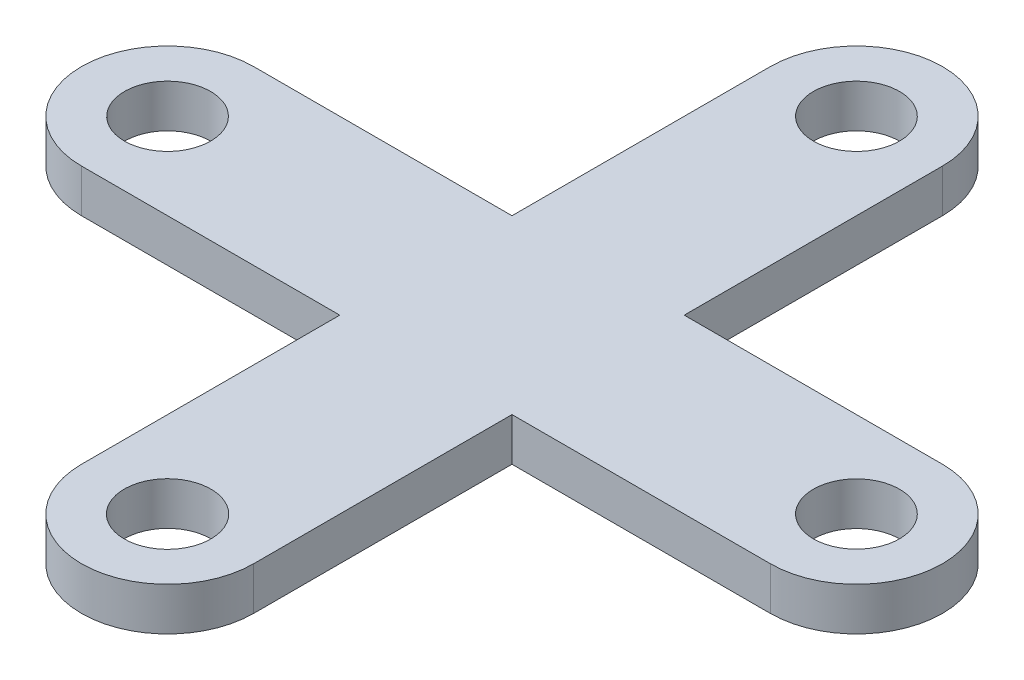
ISO-10303-21;
HEADER;
FILE_DESCRIPTION(('STEP AP214'),'2;1');
FILE_NAME('part.step','',(''),(''),'','','');
FILE_SCHEMA(('AUTOMOTIVE_DESIGN { 1 0 10303 214 1 1 1 1 }'));
ENDSEC;
DATA;
#1=APPLICATION_CONTEXT('core data for automotive mechanical design processes');
#2=APPLICATION_PROTOCOL_DEFINITION('international standard','automotive_design',2000,#1);
#3=PRODUCT_CONTEXT('',#1,'mechanical');
#4=PRODUCT('Part','Part','',(#3));
#5=PRODUCT_RELATED_PRODUCT_CATEGORY('part','',(#4));
#6=PRODUCT_DEFINITION_FORMATION('','',#4);
#7=PRODUCT_DEFINITION_CONTEXT('part definition',#1,'design');
#8=PRODUCT_DEFINITION('design','',#6,#7);
#9=PRODUCT_DEFINITION_SHAPE('','',#8);
#10=(LENGTH_UNIT() NAMED_UNIT(*) SI_UNIT(.MILLI.,.METRE.));
#11=(NAMED_UNIT(*) PLANE_ANGLE_UNIT() SI_UNIT($,.RADIAN.));
#12=(NAMED_UNIT(*) SI_UNIT($,.STERADIAN.) SOLID_ANGLE_UNIT());
#13=UNCERTAINTY_MEASURE_WITH_UNIT(LENGTH_MEASURE(1.E-05),#10,'distance_accuracy_value','');
#14=(GEOMETRIC_REPRESENTATION_CONTEXT(3) GLOBAL_UNCERTAINTY_ASSIGNED_CONTEXT((#13)) GLOBAL_UNIT_ASSIGNED_CONTEXT((#10,
#11,#12)) REPRESENTATION_CONTEXT('',''));
#15=CARTESIAN_POINT('',(0.,0.,0.));
#16=DIRECTION('',(0.,0.,1.));
#17=DIRECTION('',(1.,0.,0.));
#18=AXIS2_PLACEMENT_3D('',#15,#16,#17);
#19=CARTESIAN_POINT('',(0.,0.,0.));
#20=DIRECTION('',(0.,1.,0.));
#21=DIRECTION('',(0.,0.,1.));
#22=AXIS2_PLACEMENT_3D('',#19,#20,#21);
#23=PLANE('',#22);
#24=DIRECTION('',(0.,0.,1.));
#25=VECTOR('',#24,1.);
#26=CARTESIAN_POINT('',(12.7,0.,0.));
#27=LINE('',#26,#25);
#28=CARTESIAN_POINT('',(12.7,0.,-74.1615560527678));
#29=VERTEX_POINT('',#28);
#30=CARTESIAN_POINT('',(12.7,0.,-36.0615560527679));
#31=VERTEX_POINT('',#30);
#32=EDGE_CURVE('E165',#29,#31,#27,.T.);
#33=ORIENTED_EDGE('',*,*,#32,.T.);
#34=DIRECTION('',(1.,0.,0.));
#35=VECTOR('',#34,1.);
#36=CARTESIAN_POINT('',(0.,0.,-36.0615560527679));
#37=LINE('',#36,#35);
#38=CARTESIAN_POINT('',(50.8,0.,-36.0615560527679));
#39=VERTEX_POINT('',#38);
#40=EDGE_CURVE('E191',#31,#39,#37,.T.);
#41=ORIENTED_EDGE('',*,*,#40,.T.);
#42=CARTESIAN_POINT('',(50.8,0.,-23.3615560527679));
#43=DIRECTION('',(0.,1.,0.));
#44=DIRECTION('',(0.,0.,1.));
#45=AXIS2_PLACEMENT_3D('',#42,#43,#44);
#46=CIRCLE('',#45,12.7);
#47=CARTESIAN_POINT('',(50.8,0.,-10.6615560527679));
#48=VERTEX_POINT('',#47);
#49=EDGE_CURVE('E189',#48,#39,#46,.T.);
#50=ORIENTED_EDGE('',*,*,#49,.F.);
#51=DIRECTION('',(1.,0.,0.));
#52=VECTOR('',#51,1.);
#53=CARTESIAN_POINT('',(0.,0.,-10.6615560527679));
#54=LINE('',#53,#52);
#55=CARTESIAN_POINT('',(12.7,0.,-10.6615560527679));
#56=VERTEX_POINT('',#55);
#57=EDGE_CURVE('E152',#56,#48,#54,.T.);
#58=ORIENTED_EDGE('',*,*,#57,.F.);
#59=DIRECTION('',(0.,0.,1.));
#60=VECTOR('',#59,1.);
#61=CARTESIAN_POINT('',(12.7,0.,0.));
#62=LINE('',#61,#60);
#63=CARTESIAN_POINT('',(12.7,0.,27.4384439472321));
#64=VERTEX_POINT('',#63);
#65=EDGE_CURVE('E185',#56,#64,#62,.T.);
#66=ORIENTED_EDGE('',*,*,#65,.T.);
#67=CARTESIAN_POINT('',(0.,0.,27.4384439472321));
#68=DIRECTION('',(0.,1.,0.));
#69=DIRECTION('',(0.,0.,1.));
#70=AXIS2_PLACEMENT_3D('',#67,#68,#69);
#71=CIRCLE('',#70,12.7);
#72=CARTESIAN_POINT('',(-12.7,0.,27.4384439472321));
#73=VERTEX_POINT('',#72);
#74=EDGE_CURVE('E182',#73,#64,#71,.T.);
#75=ORIENTED_EDGE('',*,*,#74,.F.);
#76=DIRECTION('',(0.,0.,1.));
#77=VECTOR('',#76,1.);
#78=CARTESIAN_POINT('',(-12.7,0.,0.));
#79=LINE('',#78,#77);
#80=CARTESIAN_POINT('',(-12.7,0.,-10.6615560527679));
#81=VERTEX_POINT('',#80);
#82=EDGE_CURVE('E180',#81,#73,#79,.T.);
#83=ORIENTED_EDGE('',*,*,#82,.F.);
#84=DIRECTION('',(1.,0.,0.));
#85=VECTOR('',#84,1.);
#86=CARTESIAN_POINT('',(0.,0.,-10.6615560527679));
#87=LINE('',#86,#85);
#88=CARTESIAN_POINT('',(-50.8,0.,-10.6615560527679));
#89=VERTEX_POINT('',#88);
#90=EDGE_CURVE('E178',#89,#81,#87,.T.);
#91=ORIENTED_EDGE('',*,*,#90,.F.);
#92=CARTESIAN_POINT('',(-50.8,0.,-23.3615560527679));
#93=DIRECTION('',(0.,1.,0.));
#94=DIRECTION('',(0.,0.,1.));
#95=AXIS2_PLACEMENT_3D('',#92,#93,#94);
#96=CIRCLE('',#95,12.7);
#97=CARTESIAN_POINT('',(-50.8,0.,-36.0615560527679));
#98=VERTEX_POINT('',#97);
#99=EDGE_CURVE('E176',#98,#89,#96,.T.);
#100=ORIENTED_EDGE('',*,*,#99,.F.);
#101=DIRECTION('',(1.,0.,0.));
#102=VECTOR('',#101,1.);
#103=CARTESIAN_POINT('',(0.,0.,-36.0615560527679));
#104=LINE('',#103,#102);
#105=CARTESIAN_POINT('',(-12.7,0.,-36.0615560527679));
#106=VERTEX_POINT('',#105);
#107=EDGE_CURVE('E173',#98,#106,#104,.T.);
#108=ORIENTED_EDGE('',*,*,#107,.T.);
#109=DIRECTION('',(0.,0.,1.));
#110=VECTOR('',#109,1.);
#111=CARTESIAN_POINT('',(-12.7,0.,0.));
#112=LINE('',#111,#110);
#113=CARTESIAN_POINT('',(-12.7,0.,-74.1615560527678));
#114=VERTEX_POINT('',#113);
#115=EDGE_CURVE('E170',#114,#106,#112,.T.);
#116=ORIENTED_EDGE('',*,*,#115,.F.);
#117=CARTESIAN_POINT('',(0.,0.,-74.1615560527678));
#118=DIRECTION('',(0.,1.,0.));
#119=DIRECTION('',(0.,0.,1.));
#120=AXIS2_PLACEMENT_3D('',#117,#118,#119);
#121=CIRCLE('',#120,12.7);
#122=EDGE_CURVE('E167',#29,#114,#121,.T.);
#123=ORIENTED_EDGE('',*,*,#122,.F.);
#124=EDGE_LOOP('',(#33,#41,#50,#58,#66,#75,#83,#91,#100,#108,#116,#123));
#125=FACE_BOUND('',#124,.T.);
#126=CARTESIAN_POINT('',(0.,0.,-74.1615560527678));
#127=DIRECTION('',(0.,1.,0.));
#128=DIRECTION('',(0.,0.,1.));
#129=AXIS2_PLACEMENT_3D('',#126,#127,#128);
#130=CIRCLE('',#129,6.35);
#131=CARTESIAN_POINT('',(0.,0.,-67.8115560527679));
#132=VERTEX_POINT('',#131);
#133=EDGE_CURVE('E168',#132,#132,#130,.T.);
#134=ORIENTED_EDGE('',*,*,#133,.T.);
#135=EDGE_LOOP('',(#134));
#136=FACE_BOUND('',#135,.T.);
#137=CARTESIAN_POINT('',(-50.8,0.,-23.3615560527679));
#138=DIRECTION('',(0.,1.,0.));
#139=DIRECTION('',(0.,0.,1.));
#140=AXIS2_PLACEMENT_3D('',#137,#138,#139);
#141=CIRCLE('',#140,6.35);
#142=CARTESIAN_POINT('',(-50.8,0.,-17.0115560527679));
#143=VERTEX_POINT('',#142);
#144=EDGE_CURVE('E256',#143,#143,#141,.T.);
#145=ORIENTED_EDGE('',*,*,#144,.T.);
#146=EDGE_LOOP('',(#145));
#147=FACE_BOUND('',#146,.T.);
#148=CARTESIAN_POINT('',(0.,0.,27.4384439472321));
#149=DIRECTION('',(0.,1.,0.));
#150=DIRECTION('',(0.,0.,1.));
#151=AXIS2_PLACEMENT_3D('',#148,#149,#150);
#152=CIRCLE('',#151,6.38209935399388);
#153=CARTESIAN_POINT('',(0.,0.,33.820543301226));
#154=VERTEX_POINT('',#153);
#155=EDGE_CURVE('E262',#154,#154,#152,.T.);
#156=ORIENTED_EDGE('',*,*,#155,.T.);
#157=EDGE_LOOP('',(#156));
#158=FACE_BOUND('',#157,.T.);
#159=CARTESIAN_POINT('',(50.8,0.,-23.3615560527679));
#160=DIRECTION('',(0.,1.,0.));
#161=DIRECTION('',(0.,0.,1.));
#162=AXIS2_PLACEMENT_3D('',#159,#160,#161);
#163=CIRCLE('',#162,6.35);
#164=CARTESIAN_POINT('',(50.8,0.,-17.0115560527679));
#165=VERTEX_POINT('',#164);
#166=EDGE_CURVE('E268',#165,#165,#163,.T.);
#167=ORIENTED_EDGE('',*,*,#166,.T.);
#168=EDGE_LOOP('',(#167));
#169=FACE_BOUND('',#168,.T.);
#170=DIRECTION('',(1.,0.,0.));
#171=VECTOR('',#170,1.);
#172=CARTESIAN_POINT('',(0.,0.,-11.9616007035296));
#173=LINE('',#172,#171);
#174=CARTESIAN_POINT('',(-12.7,0.,-11.9616007035296));
#175=VERTEX_POINT('',#174);
#176=CARTESIAN_POINT('',(12.26032933786,0.,-11.9616007035296));
#177=VERTEX_POINT('',#176);
#178=EDGE_CURVE('E49',#175,#177,#173,.T.);
#179=ORIENTED_EDGE('',*,*,#178,.T.);
#180=DIRECTION('',(0.,0.,-1.));
#181=VECTOR('',#180,1.);
#182=CARTESIAN_POINT('',(12.26032933786,0.,0.));
#183=LINE('',#182,#181);
#184=CARTESIAN_POINT('',(12.26032933786,0.,-35.1916983963169));
#185=VERTEX_POINT('',#184);
#186=EDGE_CURVE('E294',#177,#185,#183,.T.);
#187=ORIENTED_EDGE('',*,*,#186,.T.);
#188=DIRECTION('',(1.,0.,0.));
#189=VECTOR('',#188,1.);
#190=CARTESIAN_POINT('',(0.,0.,-35.1916983963169));
#191=LINE('',#190,#189);
#192=CARTESIAN_POINT('',(-12.7,0.,-35.1916983963169));
#193=VERTEX_POINT('',#192);
#194=EDGE_CURVE('E291',#193,#185,#191,.T.);
#195=ORIENTED_EDGE('',*,*,#194,.F.);
#196=DIRECTION('',(0.,0.,-1.));
#197=VECTOR('',#196,1.);
#198=CARTESIAN_POINT('',(-12.7,0.,0.));
#199=LINE('',#198,#197);
#200=EDGE_CURVE('E287',#175,#193,#199,.T.);
#201=ORIENTED_EDGE('',*,*,#200,.F.);
#202=EDGE_LOOP('',(#179,#187,#195,#201));
#203=FACE_BOUND('',#202,.T.);
#204=ADVANCED_FACE('F34',(#125,#136,#147,#158,#169,#203),#23,.F.);
#205=CARTESIAN_POINT('',(12.7,6.35,0.));
#206=DIRECTION('',(1.,0.,0.));
#207=DIRECTION('',(0.,0.,-1.));
#208=AXIS2_PLACEMENT_3D('',#205,#206,#207);
#209=PLANE('',#208);
#210=ORIENTED_EDGE('',*,*,#32,.F.);
#211=DIRECTION('',(0.,-1.,0.));
#212=VECTOR('',#211,1.);
#213=CARTESIAN_POINT('',(12.7,6.35,-74.1615560527678));
#214=LINE('',#213,#212);
#215=CARTESIAN_POINT('',(12.7,6.35,-74.1615560527678));
#216=VERTEX_POINT('',#215);
#217=EDGE_CURVE('E11',#216,#29,#214,.T.);
#218=ORIENTED_EDGE('',*,*,#217,.F.);
#219=DIRECTION('',(0.,0.,1.));
#220=VECTOR('',#219,1.);
#221=CARTESIAN_POINT('',(12.7,6.35,0.));
#222=LINE('',#221,#220);
#223=CARTESIAN_POINT('',(12.7,6.35,-36.0615560527679));
#224=VERTEX_POINT('',#223);
#225=EDGE_CURVE('E194',#216,#224,#222,.T.);
#226=ORIENTED_EDGE('',*,*,#225,.T.);
#227=DIRECTION('',(0.,-1.,0.));
#228=VECTOR('',#227,1.);
#229=CARTESIAN_POINT('',(12.7,6.35,-36.0615560527679));
#230=LINE('',#229,#228);
#231=EDGE_CURVE('E58',#224,#31,#230,.T.);
#232=ORIENTED_EDGE('',*,*,#231,.T.);
#233=EDGE_LOOP('',(#210,#218,#226,#232));
#234=FACE_BOUND('',#233,.T.);
#235=ADVANCED_FACE('F36',(#234),#209,.T.);
#236=CARTESIAN_POINT('',(0.,6.35,-74.1615560527678));
#237=DIRECTION('',(0.,-1.,0.));
#238=DIRECTION('',(0.,0.,-1.));
#239=AXIS2_PLACEMENT_3D('',#236,#237,#238);
#240=CYLINDRICAL_SURFACE('',#239,12.7);
#241=ORIENTED_EDGE('',*,*,#122,.T.);
#242=DIRECTION('',(0.,-1.,0.));
#243=VECTOR('',#242,1.);
#244=CARTESIAN_POINT('',(-12.7,6.35,-74.1615560527678));
#245=LINE('',#244,#243);
#246=CARTESIAN_POINT('',(-12.7,6.35,-74.1615560527678));
#247=VERTEX_POINT('',#246);
#248=EDGE_CURVE('E42',#247,#114,#245,.T.);
#249=ORIENTED_EDGE('',*,*,#248,.F.);
#250=CARTESIAN_POINT('',(0.,6.35,-74.1615560527678));
#251=DIRECTION('',(0.,1.,0.));
#252=DIRECTION('',(0.,0.,1.));
#253=AXIS2_PLACEMENT_3D('',#250,#251,#252);
#254=CIRCLE('',#253,12.7);
#255=EDGE_CURVE('E237',#216,#247,#254,.T.);
#256=ORIENTED_EDGE('',*,*,#255,.F.);
#257=ORIENTED_EDGE('',*,*,#217,.T.);
#258=EDGE_LOOP('',(#241,#249,#256,#257));
#259=FACE_BOUND('',#258,.T.);
#260=ADVANCED_FACE('F348',(#259),#240,.T.);
#261=CARTESIAN_POINT('',(-12.7,6.35,0.));
#262=DIRECTION('',(1.,0.,0.));
#263=DIRECTION('',(0.,0.,-1.));
#264=AXIS2_PLACEMENT_3D('',#261,#262,#263);
#265=PLANE('',#264);
#266=ORIENTED_EDGE('',*,*,#115,.T.);
#267=DIRECTION('',(0.,-1.,0.));
#268=VECTOR('',#267,1.);
#269=CARTESIAN_POINT('',(-12.7,6.35,-36.0615560527679));
#270=LINE('',#269,#268);
#271=CARTESIAN_POINT('',(-12.7,6.35,-36.0615560527679));
#272=VERTEX_POINT('',#271);
#273=EDGE_CURVE('E211',#272,#106,#270,.T.);
#274=ORIENTED_EDGE('',*,*,#273,.F.);
#275=DIRECTION('',(0.,0.,1.));
#276=VECTOR('',#275,1.);
#277=CARTESIAN_POINT('',(-12.7,6.35,0.));
#278=LINE('',#277,#276);
#279=EDGE_CURVE('E219',#247,#272,#278,.T.);
#280=ORIENTED_EDGE('',*,*,#279,.F.);
#281=ORIENTED_EDGE('',*,*,#248,.T.);
#282=EDGE_LOOP('',(#266,#274,#280,#281));
#283=FACE_BOUND('',#282,.T.);
#284=ADVANCED_FACE('F217',(#283),#265,.F.);
#285=CARTESIAN_POINT('',(0.,6.35,-36.0615560527679));
#286=DIRECTION('',(0.,0.,-1.));
#287=DIRECTION('',(-1.,0.,0.));
#288=AXIS2_PLACEMENT_3D('',#285,#286,#287);
#289=PLANE('',#288);
#290=ORIENTED_EDGE('',*,*,#107,.F.);
#291=DIRECTION('',(0.,-1.,0.));
#292=VECTOR('',#291,1.);
#293=CARTESIAN_POINT('',(-50.8,6.35,-36.0615560527679));
#294=LINE('',#293,#292);
#295=CARTESIAN_POINT('',(-50.8,6.35,-36.0615560527679));
#296=VERTEX_POINT('',#295);
#297=EDGE_CURVE('E209',#296,#98,#294,.T.);
#298=ORIENTED_EDGE('',*,*,#297,.F.);
#299=DIRECTION('',(1.,0.,0.));
#300=VECTOR('',#299,1.);
#301=CARTESIAN_POINT('',(0.,6.35,-36.0615560527679));
#302=LINE('',#301,#300);
#303=EDGE_CURVE('E232',#296,#272,#302,.T.);
#304=ORIENTED_EDGE('',*,*,#303,.T.);
#305=ORIENTED_EDGE('',*,*,#273,.T.);
#306=EDGE_LOOP('',(#290,#298,#304,#305));
#307=FACE_BOUND('',#306,.T.);
#308=ADVANCED_FACE('F228',(#307),#289,.T.);
#309=CARTESIAN_POINT('',(-50.8,6.35,-23.3615560527679));
#310=DIRECTION('',(0.,-1.,0.));
#311=DIRECTION('',(0.,0.,-1.));
#312=AXIS2_PLACEMENT_3D('',#309,#310,#311);
#313=CYLINDRICAL_SURFACE('',#312,12.7);
#314=ORIENTED_EDGE('',*,*,#99,.T.);
#315=DIRECTION('',(0.,-1.,0.));
#316=VECTOR('',#315,1.);
#317=CARTESIAN_POINT('',(-50.8,6.35,-10.6615560527679));
#318=LINE('',#317,#316);
#319=CARTESIAN_POINT('',(-50.8,6.35,-10.6615560527679));
#320=VERTEX_POINT('',#319);
#321=EDGE_CURVE('E206',#320,#89,#318,.T.);
#322=ORIENTED_EDGE('',*,*,#321,.F.);
#323=CARTESIAN_POINT('',(-50.8,6.35,-23.3615560527679));
#324=DIRECTION('',(0.,1.,0.));
#325=DIRECTION('',(0.,0.,1.));
#326=AXIS2_PLACEMENT_3D('',#323,#324,#325);
#327=CIRCLE('',#326,12.7);
#328=EDGE_CURVE('E233',#296,#320,#327,.T.);
#329=ORIENTED_EDGE('',*,*,#328,.F.);
#330=ORIENTED_EDGE('',*,*,#297,.T.);
#331=EDGE_LOOP('',(#314,#322,#329,#330));
#332=FACE_BOUND('',#331,.T.);
#333=ADVANCED_FACE('F371',(#332),#313,.T.);
#334=CARTESIAN_POINT('',(0.,6.35,-10.6615560527679));
#335=DIRECTION('',(0.,0.,-1.));
#336=DIRECTION('',(-1.,0.,0.));
#337=AXIS2_PLACEMENT_3D('',#334,#335,#336);
#338=PLANE('',#337);
#339=ORIENTED_EDGE('',*,*,#90,.T.);
#340=DIRECTION('',(0.,-1.,0.));
#341=VECTOR('',#340,1.);
#342=CARTESIAN_POINT('',(-12.7,6.35,-10.6615560527679));
#343=LINE('',#342,#341);
#344=CARTESIAN_POINT('',(-12.7,6.35,-10.6615560527679));
#345=VERTEX_POINT('',#344);
#346=EDGE_CURVE('E203',#345,#81,#343,.T.);
#347=ORIENTED_EDGE('',*,*,#346,.F.);
#348=DIRECTION('',(1.,0.,0.));
#349=VECTOR('',#348,1.);
#350=CARTESIAN_POINT('',(0.,6.35,-10.6615560527679));
#351=LINE('',#350,#349);
#352=EDGE_CURVE('E235',#320,#345,#351,.T.);
#353=ORIENTED_EDGE('',*,*,#352,.F.);
#354=ORIENTED_EDGE('',*,*,#321,.T.);
#355=EDGE_LOOP('',(#339,#347,#353,#354));
#356=FACE_BOUND('',#355,.T.);
#357=ADVANCED_FACE('F367',(#356),#338,.F.);
#358=CARTESIAN_POINT('',(-12.7,6.35,0.));
#359=DIRECTION('',(1.,0.,0.));
#360=DIRECTION('',(0.,0.,-1.));
#361=AXIS2_PLACEMENT_3D('',#358,#359,#360);
#362=PLANE('',#361);
#363=ORIENTED_EDGE('',*,*,#82,.T.);
#364=DIRECTION('',(0.,-1.,0.));
#365=VECTOR('',#364,1.);
#366=CARTESIAN_POINT('',(-12.7,6.35,27.4384439472321));
#367=LINE('',#366,#365);
#368=CARTESIAN_POINT('',(-12.7,6.35,27.4384439472321));
#369=VERTEX_POINT('',#368);
#370=EDGE_CURVE('E200',#369,#73,#367,.T.);
#371=ORIENTED_EDGE('',*,*,#370,.F.);
#372=DIRECTION('',(0.,0.,1.));
#373=VECTOR('',#372,1.);
#374=CARTESIAN_POINT('',(-12.7,6.35,0.));
#375=LINE('',#374,#373);
#376=EDGE_CURVE('E242',#345,#369,#375,.T.);
#377=ORIENTED_EDGE('',*,*,#376,.F.);
#378=ORIENTED_EDGE('',*,*,#346,.T.);
#379=EDGE_LOOP('',(#363,#371,#377,#378));
#380=FACE_BOUND('',#379,.T.);
#381=ADVANCED_FACE('F363',(#380),#362,.F.);
#382=CARTESIAN_POINT('',(0.,6.35,27.4384439472321));
#383=DIRECTION('',(0.,-1.,0.));
#384=DIRECTION('',(0.,0.,-1.));
#385=AXIS2_PLACEMENT_3D('',#382,#383,#384);
#386=CYLINDRICAL_SURFACE('',#385,12.7);
#387=ORIENTED_EDGE('',*,*,#74,.T.);
#388=DIRECTION('',(0.,-1.,0.));
#389=VECTOR('',#388,1.);
#390=CARTESIAN_POINT('',(12.7,6.35,27.4384439472321));
#391=LINE('',#390,#389);
#392=CARTESIAN_POINT('',(12.7,6.35,27.4384439472321));
#393=VERTEX_POINT('',#392);
#394=EDGE_CURVE('E198',#393,#64,#391,.T.);
#395=ORIENTED_EDGE('',*,*,#394,.F.);
#396=CARTESIAN_POINT('',(0.,6.35,27.4384439472321));
#397=DIRECTION('',(0.,1.,0.));
#398=DIRECTION('',(0.,0.,1.));
#399=AXIS2_PLACEMENT_3D('',#396,#397,#398);
#400=CIRCLE('',#399,12.7);
#401=EDGE_CURVE('E244',#369,#393,#400,.T.);
#402=ORIENTED_EDGE('',*,*,#401,.F.);
#403=ORIENTED_EDGE('',*,*,#370,.T.);
#404=EDGE_LOOP('',(#387,#395,#402,#403));
#405=FACE_BOUND('',#404,.T.);
#406=ADVANCED_FACE('F360',(#405),#386,.T.);
#407=CARTESIAN_POINT('',(12.7,6.35,0.));
#408=DIRECTION('',(1.,0.,0.));
#409=DIRECTION('',(0.,0.,-1.));
#410=AXIS2_PLACEMENT_3D('',#407,#408,#409);
#411=PLANE('',#410);
#412=ORIENTED_EDGE('',*,*,#65,.F.);
#413=DIRECTION('',(0.,-1.,0.));
#414=VECTOR('',#413,1.);
#415=CARTESIAN_POINT('',(12.7,6.35,-10.6615560527679));
#416=LINE('',#415,#414);
#417=CARTESIAN_POINT('',(12.7,6.35,-10.6615560527679));
#418=VERTEX_POINT('',#417);
#419=EDGE_CURVE('E156',#418,#56,#416,.T.);
#420=ORIENTED_EDGE('',*,*,#419,.F.);
#421=DIRECTION('',(0.,0.,1.));
#422=VECTOR('',#421,1.);
#423=CARTESIAN_POINT('',(12.7,6.35,0.));
#424=LINE('',#423,#422);
#425=EDGE_CURVE('E145',#418,#393,#424,.T.);
#426=ORIENTED_EDGE('',*,*,#425,.T.);
#427=ORIENTED_EDGE('',*,*,#394,.T.);
#428=EDGE_LOOP('',(#412,#420,#426,#427));
#429=FACE_BOUND('',#428,.T.);
#430=ADVANCED_FACE('F247',(#429),#411,.T.);
#431=CARTESIAN_POINT('',(0.,6.35,-10.6615560527679));
#432=DIRECTION('',(0.,0.,-1.));
#433=DIRECTION('',(-1.,0.,0.));
#434=AXIS2_PLACEMENT_3D('',#431,#432,#433);
#435=PLANE('',#434);
#436=ORIENTED_EDGE('',*,*,#57,.T.);
#437=DIRECTION('',(0.,-1.,0.));
#438=VECTOR('',#437,1.);
#439=CARTESIAN_POINT('',(50.8,6.35,-10.6615560527679));
#440=LINE('',#439,#438);
#441=CARTESIAN_POINT('',(50.8,6.35,-10.6615560527679));
#442=VERTEX_POINT('',#441);
#443=EDGE_CURVE('E149',#442,#48,#440,.T.);
#444=ORIENTED_EDGE('',*,*,#443,.F.);
#445=DIRECTION('',(1.,0.,0.));
#446=VECTOR('',#445,1.);
#447=CARTESIAN_POINT('',(0.,6.35,-10.6615560527679));
#448=LINE('',#447,#446);
#449=EDGE_CURVE('E136',#418,#442,#448,.T.);
#450=ORIENTED_EDGE('',*,*,#449,.F.);
#451=ORIENTED_EDGE('',*,*,#419,.T.);
#452=EDGE_LOOP('',(#436,#444,#450,#451));
#453=FACE_BOUND('',#452,.T.);
#454=ADVANCED_FACE('F150',(#453),#435,.F.);
#455=CARTESIAN_POINT('',(50.8,6.35,-23.3615560527679));
#456=DIRECTION('',(0.,-1.,0.));
#457=DIRECTION('',(0.,0.,-1.));
#458=AXIS2_PLACEMENT_3D('',#455,#456,#457);
#459=CYLINDRICAL_SURFACE('',#458,12.7);
#460=ORIENTED_EDGE('',*,*,#49,.T.);
#461=DIRECTION('',(0.,-1.,0.));
#462=VECTOR('',#461,1.);
#463=CARTESIAN_POINT('',(50.8,6.35,-36.0615560527679));
#464=LINE('',#463,#462);
#465=CARTESIAN_POINT('',(50.8,6.35,-36.0615560527679));
#466=VERTEX_POINT('',#465);
#467=EDGE_CURVE('E157',#466,#39,#464,.T.);
#468=ORIENTED_EDGE('',*,*,#467,.F.);
#469=CARTESIAN_POINT('',(50.8,6.35,-23.3615560527679));
#470=DIRECTION('',(0.,1.,0.));
#471=DIRECTION('',(0.,0.,1.));
#472=AXIS2_PLACEMENT_3D('',#469,#470,#471);
#473=CIRCLE('',#472,12.7);
#474=EDGE_CURVE('E142',#442,#466,#473,.T.);
#475=ORIENTED_EDGE('',*,*,#474,.F.);
#476=ORIENTED_EDGE('',*,*,#443,.T.);
#477=EDGE_LOOP('',(#460,#468,#475,#476));
#478=FACE_BOUND('',#477,.T.);
#479=ADVANCED_FACE('F159',(#478),#459,.T.);
#480=CARTESIAN_POINT('',(0.,6.35,-36.0615560527679));
#481=DIRECTION('',(0.,0.,-1.));
#482=DIRECTION('',(-1.,0.,0.));
#483=AXIS2_PLACEMENT_3D('',#480,#481,#482);
#484=PLANE('',#483);
#485=ORIENTED_EDGE('',*,*,#40,.F.);
#486=ORIENTED_EDGE('',*,*,#231,.F.);
#487=DIRECTION('',(1.,0.,0.));
#488=VECTOR('',#487,1.);
#489=CARTESIAN_POINT('',(0.,6.35,-36.0615560527679));
#490=LINE('',#489,#488);
#491=EDGE_CURVE('E160',#224,#466,#490,.T.);
#492=ORIENTED_EDGE('',*,*,#491,.T.);
#493=ORIENTED_EDGE('',*,*,#467,.T.);
#494=EDGE_LOOP('',(#485,#486,#492,#493));
#495=FACE_BOUND('',#494,.T.);
#496=ADVANCED_FACE('F250',(#495),#484,.T.);
#497=CARTESIAN_POINT('',(0.,6.35,0.));
#498=DIRECTION('',(0.,1.,0.));
#499=DIRECTION('',(0.,0.,1.));
#500=AXIS2_PLACEMENT_3D('',#497,#498,#499);
#501=PLANE('',#500);
#502=CARTESIAN_POINT('',(50.8,6.35,-23.3615560527679));
#503=DIRECTION('',(0.,1.,0.));
#504=DIRECTION('',(0.,0.,1.));
#505=AXIS2_PLACEMENT_3D('',#502,#503,#504);
#506=CIRCLE('',#505,6.35);
#507=CARTESIAN_POINT('',(50.8,6.35,-17.0115560527679));
#508=VERTEX_POINT('',#507);
#509=EDGE_CURVE('E271',#508,#508,#506,.T.);
#510=ORIENTED_EDGE('',*,*,#509,.F.);
#511=EDGE_LOOP('',(#510));
#512=FACE_BOUND('',#511,.T.);
#513=CARTESIAN_POINT('',(0.,6.35,27.4384439472321));
#514=DIRECTION('',(0.,1.,0.));
#515=DIRECTION('',(0.,0.,1.));
#516=AXIS2_PLACEMENT_3D('',#513,#514,#515);
#517=CIRCLE('',#516,6.38209935399388);
#518=CARTESIAN_POINT('',(0.,6.35,33.820543301226));
#519=VERTEX_POINT('',#518);
#520=EDGE_CURVE('E265',#519,#519,#517,.T.);
#521=ORIENTED_EDGE('',*,*,#520,.F.);
#522=EDGE_LOOP('',(#521));
#523=FACE_BOUND('',#522,.T.);
#524=CARTESIAN_POINT('',(-50.8,6.35,-23.3615560527679));
#525=DIRECTION('',(0.,1.,0.));
#526=DIRECTION('',(0.,0.,1.));
#527=AXIS2_PLACEMENT_3D('',#524,#525,#526);
#528=CIRCLE('',#527,6.35);
#529=CARTESIAN_POINT('',(-50.8,6.35,-17.0115560527679));
#530=VERTEX_POINT('',#529);
#531=EDGE_CURVE('E259',#530,#530,#528,.T.);
#532=ORIENTED_EDGE('',*,*,#531,.F.);
#533=EDGE_LOOP('',(#532));
#534=FACE_BOUND('',#533,.T.);
#535=CARTESIAN_POINT('',(0.,6.35,-74.1615560527678));
#536=DIRECTION('',(0.,1.,0.));
#537=DIRECTION('',(0.,0.,1.));
#538=AXIS2_PLACEMENT_3D('',#535,#536,#537);
#539=CIRCLE('',#538,6.35);
#540=CARTESIAN_POINT('',(0.,6.35,-67.8115560527679));
#541=VERTEX_POINT('',#540);
#542=EDGE_CURVE('E253',#541,#541,#539,.T.);
#543=ORIENTED_EDGE('',*,*,#542,.F.);
#544=EDGE_LOOP('',(#543));
#545=FACE_BOUND('',#544,.T.);
#546=ORIENTED_EDGE('',*,*,#225,.F.);
#547=ORIENTED_EDGE('',*,*,#255,.T.);
#548=ORIENTED_EDGE('',*,*,#279,.T.);
#549=ORIENTED_EDGE('',*,*,#303,.F.);
#550=ORIENTED_EDGE('',*,*,#328,.T.);
#551=ORIENTED_EDGE('',*,*,#352,.T.);
#552=ORIENTED_EDGE('',*,*,#376,.T.);
#553=ORIENTED_EDGE('',*,*,#401,.T.);
#554=ORIENTED_EDGE('',*,*,#425,.F.);
#555=ORIENTED_EDGE('',*,*,#449,.T.);
#556=ORIENTED_EDGE('',*,*,#474,.T.);
#557=ORIENTED_EDGE('',*,*,#491,.F.);
#558=EDGE_LOOP('',(#546,#547,#548,#549,#550,#551,#552,#553,#554,#555,#556,#557));
#559=FACE_BOUND('',#558,.T.);
#560=ADVANCED_FACE('F139',(#512,#523,#534,#545,#559),#501,.T.);
#561=CARTESIAN_POINT('',(0.,0.,-74.1615560527678));
#562=DIRECTION('',(0.,1.,0.));
#563=DIRECTION('',(0.,0.,1.));
#564=AXIS2_PLACEMENT_3D('',#561,#562,#563);
#565=CYLINDRICAL_SURFACE('',#564,6.35);
#566=ORIENTED_EDGE('',*,*,#133,.F.);
#567=EDGE_LOOP('',(#566));
#568=FACE_BOUND('',#567,.T.);
#569=ORIENTED_EDGE('',*,*,#542,.T.);
#570=EDGE_LOOP('',(#569));
#571=FACE_BOUND('',#570,.T.);
#572=ADVANCED_FACE('F430',(#568,#571),#565,.F.);
#573=CARTESIAN_POINT('',(-50.8,0.,-23.3615560527679));
#574=DIRECTION('',(0.,1.,0.));
#575=DIRECTION('',(0.,0.,1.));
#576=AXIS2_PLACEMENT_3D('',#573,#574,#575);
#577=CYLINDRICAL_SURFACE('',#576,6.35);
#578=ORIENTED_EDGE('',*,*,#144,.F.);
#579=EDGE_LOOP('',(#578));
#580=FACE_BOUND('',#579,.T.);
#581=ORIENTED_EDGE('',*,*,#531,.T.);
#582=EDGE_LOOP('',(#581));
#583=FACE_BOUND('',#582,.T.);
#584=ADVANCED_FACE('F437',(#580,#583),#577,.F.);
#585=CARTESIAN_POINT('',(0.,0.,27.4384439472321));
#586=DIRECTION('',(0.,1.,0.));
#587=DIRECTION('',(0.,0.,1.));
#588=AXIS2_PLACEMENT_3D('',#585,#586,#587);
#589=CYLINDRICAL_SURFACE('',#588,6.38209935399388);
#590=ORIENTED_EDGE('',*,*,#155,.F.);
#591=EDGE_LOOP('',(#590));
#592=FACE_BOUND('',#591,.T.);
#593=ORIENTED_EDGE('',*,*,#520,.T.);
#594=EDGE_LOOP('',(#593));
#595=FACE_BOUND('',#594,.T.);
#596=ADVANCED_FACE('F444',(#592,#595),#589,.F.);
#597=CARTESIAN_POINT('',(50.8,0.,-23.3615560527679));
#598=DIRECTION('',(0.,1.,0.));
#599=DIRECTION('',(0.,0.,1.));
#600=AXIS2_PLACEMENT_3D('',#597,#598,#599);
#601=CYLINDRICAL_SURFACE('',#600,6.35);
#602=ORIENTED_EDGE('',*,*,#166,.F.);
#603=EDGE_LOOP('',(#602));
#604=FACE_BOUND('',#603,.T.);
#605=ORIENTED_EDGE('',*,*,#509,.T.);
#606=EDGE_LOOP('',(#605));
#607=FACE_BOUND('',#606,.T.);
#608=ADVANCED_FACE('F452',(#604,#607),#601,.F.);
#609=CARTESIAN_POINT('',(0.,2.54,-11.9616007035296));
#610=DIRECTION('',(0.,0.,-1.));
#611=DIRECTION('',(-1.,0.,0.));
#612=AXIS2_PLACEMENT_3D('',#609,#610,#611);
#613=PLANE('',#612);
#614=ORIENTED_EDGE('',*,*,#178,.F.);
#615=DIRECTION('',(0.,-1.,0.));
#616=VECTOR('',#615,1.);
#617=CARTESIAN_POINT('',(-12.7,2.54,-11.9616007035296));
#618=LINE('',#617,#616);
#619=CARTESIAN_POINT('',(-12.7,2.54,-11.9616007035296));
#620=VERTEX_POINT('',#619);
#621=EDGE_CURVE('E284',#620,#175,#618,.T.);
#622=ORIENTED_EDGE('',*,*,#621,.F.);
#623=DIRECTION('',(1.,0.,0.));
#624=VECTOR('',#623,1.);
#625=CARTESIAN_POINT('',(0.,2.54,-11.9616007035296));
#626=LINE('',#625,#624);
#627=CARTESIAN_POINT('',(12.26032933786,2.54,-11.9616007035296));
#628=VERTEX_POINT('',#627);
#629=EDGE_CURVE('E290',#620,#628,#626,.T.);
#630=ORIENTED_EDGE('',*,*,#629,.T.);
#631=DIRECTION('',(0.,-1.,0.));
#632=VECTOR('',#631,1.);
#633=CARTESIAN_POINT('',(12.26032933786,2.54,-11.9616007035296));
#634=LINE('',#633,#632);
#635=EDGE_CURVE('E274',#628,#177,#634,.T.);
#636=ORIENTED_EDGE('',*,*,#635,.T.);
#637=EDGE_LOOP('',(#614,#622,#630,#636));
#638=FACE_BOUND('',#637,.T.);
#639=ADVANCED_FACE('F310',(#638),#613,.T.);
#640=CARTESIAN_POINT('',(12.26032933786,2.54,0.));
#641=DIRECTION('',(-1.,0.,0.));
#642=DIRECTION('',(0.,0.,1.));
#643=AXIS2_PLACEMENT_3D('',#640,#641,#642);
#644=PLANE('',#643);
#645=ORIENTED_EDGE('',*,*,#186,.F.);
#646=ORIENTED_EDGE('',*,*,#635,.F.);
#647=DIRECTION('',(0.,0.,-1.));
#648=VECTOR('',#647,1.);
#649=CARTESIAN_POINT('',(12.26032933786,2.54,0.));
#650=LINE('',#649,#648);
#651=CARTESIAN_POINT('',(12.26032933786,2.54,-35.1916983963169));
#652=VERTEX_POINT('',#651);
#653=EDGE_CURVE('E303',#628,#652,#650,.T.);
#654=ORIENTED_EDGE('',*,*,#653,.T.);
#655=DIRECTION('',(0.,-1.,0.));
#656=VECTOR('',#655,1.);
#657=CARTESIAN_POINT('',(12.26032933786,2.54,-35.1916983963169));
#658=LINE('',#657,#656);
#659=EDGE_CURVE('E278',#652,#185,#658,.T.);
#660=ORIENTED_EDGE('',*,*,#659,.T.);
#661=EDGE_LOOP('',(#645,#646,#654,#660));
#662=FACE_BOUND('',#661,.T.);
#663=ADVANCED_FACE('F319',(#662),#644,.T.);
#664=CARTESIAN_POINT('',(0.,2.54,-35.1916983963169));
#665=DIRECTION('',(0.,0.,-1.));
#666=DIRECTION('',(-1.,0.,0.));
#667=AXIS2_PLACEMENT_3D('',#664,#665,#666);
#668=PLANE('',#667);
#669=ORIENTED_EDGE('',*,*,#194,.T.);
#670=ORIENTED_EDGE('',*,*,#659,.F.);
#671=DIRECTION('',(1.,0.,0.));
#672=VECTOR('',#671,1.);
#673=CARTESIAN_POINT('',(0.,2.54,-35.1916983963169));
#674=LINE('',#673,#672);
#675=CARTESIAN_POINT('',(-12.7,2.54,-35.1916983963169));
#676=VERTEX_POINT('',#675);
#677=EDGE_CURVE('E300',#676,#652,#674,.T.);
#678=ORIENTED_EDGE('',*,*,#677,.F.);
#679=DIRECTION('',(0.,-1.,0.));
#680=VECTOR('',#679,1.);
#681=CARTESIAN_POINT('',(-12.7,2.54,-35.1916983963169));
#682=LINE('',#681,#680);
#683=EDGE_CURVE('E281',#676,#193,#682,.T.);
#684=ORIENTED_EDGE('',*,*,#683,.T.);
#685=EDGE_LOOP('',(#669,#670,#678,#684));
#686=FACE_BOUND('',#685,.T.);
#687=ADVANCED_FACE('F335',(#686),#668,.F.);
#688=CARTESIAN_POINT('',(-12.7,2.54,0.));
#689=DIRECTION('',(-1.,0.,0.));
#690=DIRECTION('',(0.,0.,1.));
#691=AXIS2_PLACEMENT_3D('',#688,#689,#690);
#692=PLANE('',#691);
#693=ORIENTED_EDGE('',*,*,#200,.T.);
#694=ORIENTED_EDGE('',*,*,#683,.F.);
#695=DIRECTION('',(0.,0.,-1.));
#696=VECTOR('',#695,1.);
#697=CARTESIAN_POINT('',(-12.7,2.54,0.));
#698=LINE('',#697,#696);
#699=EDGE_CURVE('E286',#620,#676,#698,.T.);
#700=ORIENTED_EDGE('',*,*,#699,.F.);
#701=ORIENTED_EDGE('',*,*,#621,.T.);
#702=EDGE_LOOP('',(#693,#694,#700,#701));
#703=FACE_BOUND('',#702,.T.);
#704=ADVANCED_FACE('F333',(#703),#692,.F.);
#705=CARTESIAN_POINT('',(0.,2.54,0.));
#706=DIRECTION('',(0.,1.,0.));
#707=DIRECTION('',(0.,0.,1.));
#708=AXIS2_PLACEMENT_3D('',#705,#706,#707);
#709=PLANE('',#708);
#710=ORIENTED_EDGE('',*,*,#629,.F.);
#711=ORIENTED_EDGE('',*,*,#699,.T.);
#712=ORIENTED_EDGE('',*,*,#677,.T.);
#713=ORIENTED_EDGE('',*,*,#653,.F.);
#714=EDGE_LOOP('',(#710,#711,#712,#713));
#715=FACE_BOUND('',#714,.T.);
#716=ADVANCED_FACE('F336',(#715),#709,.F.);
#717=CLOSED_SHELL('',(#204,#235,#260,#284,#308,#333,#357,#381,#406,#430,#454,#479,#496,#560,
#572,#584,#596,#608,#639,#663,#687,#704,#716));
#718=MANIFOLD_SOLID_BREP('B2',#717);
#719=ADVANCED_BREP_SHAPE_REPRESENTATION('',(#18,#718),#14);
#720=SHAPE_DEFINITION_REPRESENTATION(#9,#719);
ENDSEC;
END-ISO-10303-21;
